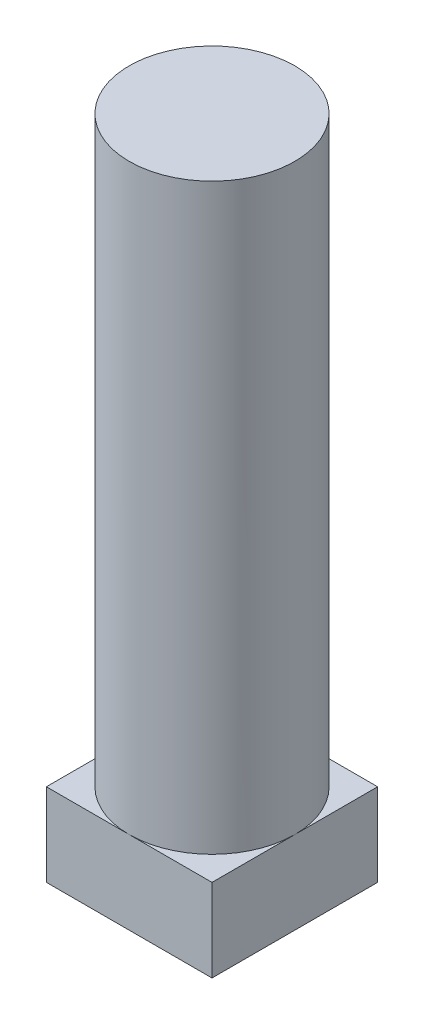
ISO-10303-21;
HEADER;
FILE_DESCRIPTION(('STEP AP214'),'2;1');
FILE_NAME('part.step','',(''),(''),'','','');
FILE_SCHEMA(('AUTOMOTIVE_DESIGN { 1 0 10303 214 1 1 1 1 }'));
ENDSEC;
DATA;
#1=APPLICATION_CONTEXT('core data for automotive mechanical design processes');
#2=APPLICATION_PROTOCOL_DEFINITION('international standard','automotive_design',2000,#1);
#3=PRODUCT_CONTEXT('',#1,'mechanical');
#4=PRODUCT('Part','Part','',(#3));
#5=PRODUCT_RELATED_PRODUCT_CATEGORY('part','',(#4));
#6=PRODUCT_DEFINITION_FORMATION('','',#4);
#7=PRODUCT_DEFINITION_CONTEXT('part definition',#1,'design');
#8=PRODUCT_DEFINITION('design','',#6,#7);
#9=PRODUCT_DEFINITION_SHAPE('','',#8);
#10=(LENGTH_UNIT() NAMED_UNIT(*) SI_UNIT(.MILLI.,.METRE.));
#11=(NAMED_UNIT(*) PLANE_ANGLE_UNIT() SI_UNIT($,.RADIAN.));
#12=(NAMED_UNIT(*) SI_UNIT($,.STERADIAN.) SOLID_ANGLE_UNIT());
#13=UNCERTAINTY_MEASURE_WITH_UNIT(LENGTH_MEASURE(1.E-05),#10,'distance_accuracy_value','');
#14=(GEOMETRIC_REPRESENTATION_CONTEXT(3) GLOBAL_UNCERTAINTY_ASSIGNED_CONTEXT((#13)) GLOBAL_UNIT_ASSIGNED_CONTEXT((#10,
#11,#12)) REPRESENTATION_CONTEXT('',''));
#15=CARTESIAN_POINT('',(0.,0.,0.));
#16=DIRECTION('',(0.,0.,1.));
#17=DIRECTION('',(1.,0.,0.));
#18=AXIS2_PLACEMENT_3D('',#15,#16,#17);
#19=CARTESIAN_POINT('',(0.,2.5,0.));
#20=DIRECTION('',(0.,1.,0.));
#21=DIRECTION('',(0.,0.,1.));
#22=AXIS2_PLACEMENT_3D('',#19,#20,#21);
#23=PLANE('',#22);
#24=CARTESIAN_POINT('',(0.,2.5,0.));
#25=DIRECTION('',(0.,1.,0.));
#26=DIRECTION('',(0.,0.,1.));
#27=AXIS2_PLACEMENT_3D('',#24,#25,#26);
#28=CIRCLE('',#27,2.5);
#29=CARTESIAN_POINT('',(0.,2.5,2.5));
#30=VERTEX_POINT('',#29);
#31=CARTESIAN_POINT('',(2.5,2.5,0.));
#32=VERTEX_POINT('',#31);
#33=EDGE_CURVE('E49',#30,#32,#28,.T.);
#34=ORIENTED_EDGE('',*,*,#33,.F.);
#35=DIRECTION('',(1.,0.,0.));
#36=VECTOR('',#35,1.);
#37=CARTESIAN_POINT('',(-2.5,2.5,2.5));
#38=LINE('',#37,#36);
#39=CARTESIAN_POINT('',(2.5,2.5,2.5));
#40=VERTEX_POINT('',#39);
#41=EDGE_CURVE('E100',#30,#40,#38,.T.);
#42=ORIENTED_EDGE('',*,*,#41,.T.);
#43=DIRECTION('',(0.,0.,-1.));
#44=VECTOR('',#43,1.);
#45=CARTESIAN_POINT('',(2.5,2.5,2.5));
#46=LINE('',#45,#44);
#47=EDGE_CURVE('E111',#40,#32,#46,.T.);
#48=ORIENTED_EDGE('',*,*,#47,.T.);
#49=EDGE_LOOP('',(#34,#42,#48));
#50=FACE_BOUND('',#49,.T.);
#51=ADVANCED_FACE('F38',(#50),#23,.T.);
#52=CARTESIAN_POINT('',(0.,2.5,-2.5));
#53=VERTEX_POINT('',#52);
#54=EDGE_CURVE('E11',#32,#53,#28,.T.);
#55=ORIENTED_EDGE('',*,*,#54,.F.);
#56=CARTESIAN_POINT('',(2.5,2.5,-2.5));
#57=VERTEX_POINT('',#56);
#58=EDGE_CURVE('E99',#32,#57,#46,.T.);
#59=ORIENTED_EDGE('',*,*,#58,.T.);
#60=DIRECTION('',(1.,0.,0.));
#61=VECTOR('',#60,1.);
#62=CARTESIAN_POINT('',(-2.5,2.5,-2.5));
#63=LINE('',#62,#61);
#64=EDGE_CURVE('E119',#53,#57,#63,.T.);
#65=ORIENTED_EDGE('',*,*,#64,.F.);
#66=EDGE_LOOP('',(#55,#59,#65));
#67=FACE_BOUND('',#66,.T.);
#68=ADVANCED_FACE('F155',(#67),#23,.T.);
#69=CARTESIAN_POINT('',(-2.5,2.5,0.));
#70=VERTEX_POINT('',#69);
#71=EDGE_CURVE('E47',#53,#70,#28,.T.);
#72=ORIENTED_EDGE('',*,*,#71,.F.);
#73=CARTESIAN_POINT('',(-2.5,2.5,-2.5));
#74=VERTEX_POINT('',#73);
#75=EDGE_CURVE('E120',#74,#53,#63,.T.);
#76=ORIENTED_EDGE('',*,*,#75,.F.);
#77=DIRECTION('',(0.,0.,-1.));
#78=VECTOR('',#77,1.);
#79=CARTESIAN_POINT('',(-2.5,2.5,2.5));
#80=LINE('',#79,#78);
#81=EDGE_CURVE('E123',#70,#74,#80,.T.);
#82=ORIENTED_EDGE('',*,*,#81,.F.);
#83=EDGE_LOOP('',(#72,#76,#82));
#84=FACE_BOUND('',#83,.T.);
#85=ADVANCED_FACE('F153',(#84),#23,.T.);
#86=CARTESIAN_POINT('',(-2.5,2.5,2.5));
#87=DIRECTION('',(0.,0.,-1.));
#88=DIRECTION('',(-1.,0.,0.));
#89=AXIS2_PLACEMENT_3D('',#86,#87,#88);
#90=PLANE('',#89);
#91=DIRECTION('',(1.,0.,0.));
#92=VECTOR('',#91,1.);
#93=CARTESIAN_POINT('',(-2.5,0.,2.5));
#94=LINE('',#93,#92);
#95=CARTESIAN_POINT('',(-2.5,0.,2.5));
#96=VERTEX_POINT('',#95);
#97=CARTESIAN_POINT('',(2.5,0.,2.5));
#98=VERTEX_POINT('',#97);
#99=EDGE_CURVE('E126',#96,#98,#94,.T.);
#100=ORIENTED_EDGE('',*,*,#99,.T.);
#101=DIRECTION('',(0.,-1.,0.));
#102=VECTOR('',#101,1.);
#103=CARTESIAN_POINT('',(2.5,2.5,2.5));
#104=LINE('',#103,#102);
#105=EDGE_CURVE('E42',#40,#98,#104,.T.);
#106=ORIENTED_EDGE('',*,*,#105,.F.);
#107=ORIENTED_EDGE('',*,*,#41,.F.);
#108=CARTESIAN_POINT('',(-2.5,2.5,2.5));
#109=VERTEX_POINT('',#108);
#110=EDGE_CURVE('E93',#109,#30,#38,.T.);
#111=ORIENTED_EDGE('',*,*,#110,.F.);
#112=DIRECTION('',(0.,-1.,0.));
#113=VECTOR('',#112,1.);
#114=CARTESIAN_POINT('',(-2.5,2.5,2.5));
#115=LINE('',#114,#113);
#116=EDGE_CURVE('E125',#109,#96,#115,.T.);
#117=ORIENTED_EDGE('',*,*,#116,.T.);
#118=EDGE_LOOP('',(#100,#106,#107,#111,#117));
#119=FACE_BOUND('',#118,.T.);
#120=ADVANCED_FACE('F40',(#119),#90,.F.);
#121=CARTESIAN_POINT('',(2.5,2.5,2.5));
#122=DIRECTION('',(-1.,0.,0.));
#123=DIRECTION('',(0.,0.,1.));
#124=AXIS2_PLACEMENT_3D('',#121,#122,#123);
#125=PLANE('',#124);
#126=DIRECTION('',(0.,0.,-1.));
#127=VECTOR('',#126,1.);
#128=CARTESIAN_POINT('',(2.5,0.,2.5));
#129=LINE('',#128,#127);
#130=CARTESIAN_POINT('',(2.5,0.,-2.5));
#131=VERTEX_POINT('',#130);
#132=EDGE_CURVE('E128',#98,#131,#129,.T.);
#133=ORIENTED_EDGE('',*,*,#132,.T.);
#134=DIRECTION('',(0.,-1.,0.));
#135=VECTOR('',#134,1.);
#136=CARTESIAN_POINT('',(2.5,2.5,-2.5));
#137=LINE('',#136,#135);
#138=EDGE_CURVE('E115',#57,#131,#137,.T.);
#139=ORIENTED_EDGE('',*,*,#138,.F.);
#140=ORIENTED_EDGE('',*,*,#58,.F.);
#141=ORIENTED_EDGE('',*,*,#47,.F.);
#142=ORIENTED_EDGE('',*,*,#105,.T.);
#143=EDGE_LOOP('',(#133,#139,#140,#141,#142));
#144=FACE_BOUND('',#143,.T.);
#145=ADVANCED_FACE('F146',(#144),#125,.F.);
#146=CARTESIAN_POINT('',(-2.5,2.5,-2.5));
#147=DIRECTION('',(0.,0.,-1.));
#148=DIRECTION('',(-1.,0.,0.));
#149=AXIS2_PLACEMENT_3D('',#146,#147,#148);
#150=PLANE('',#149);
#151=DIRECTION('',(1.,0.,0.));
#152=VECTOR('',#151,1.);
#153=CARTESIAN_POINT('',(-2.5,0.,-2.5));
#154=LINE('',#153,#152);
#155=CARTESIAN_POINT('',(-2.5,0.,-2.5));
#156=VERTEX_POINT('',#155);
#157=EDGE_CURVE('E131',#156,#131,#154,.T.);
#158=ORIENTED_EDGE('',*,*,#157,.F.);
#159=DIRECTION('',(0.,-1.,0.));
#160=VECTOR('',#159,1.);
#161=CARTESIAN_POINT('',(-2.5,2.5,-2.5));
#162=LINE('',#161,#160);
#163=EDGE_CURVE('E137',#74,#156,#162,.T.);
#164=ORIENTED_EDGE('',*,*,#163,.F.);
#165=ORIENTED_EDGE('',*,*,#75,.T.);
#166=ORIENTED_EDGE('',*,*,#64,.T.);
#167=ORIENTED_EDGE('',*,*,#138,.T.);
#168=EDGE_LOOP('',(#158,#164,#165,#166,#167));
#169=FACE_BOUND('',#168,.T.);
#170=ADVANCED_FACE('F141',(#169),#150,.T.);
#171=CARTESIAN_POINT('',(-2.5,2.5,2.5));
#172=DIRECTION('',(-1.,0.,0.));
#173=DIRECTION('',(0.,0.,1.));
#174=AXIS2_PLACEMENT_3D('',#171,#172,#173);
#175=PLANE('',#174);
#176=DIRECTION('',(0.,0.,-1.));
#177=VECTOR('',#176,1.);
#178=CARTESIAN_POINT('',(-2.5,0.,2.5));
#179=LINE('',#178,#177);
#180=EDGE_CURVE('E109',#96,#156,#179,.T.);
#181=ORIENTED_EDGE('',*,*,#180,.F.);
#182=ORIENTED_EDGE('',*,*,#116,.F.);
#183=EDGE_CURVE('E97',#109,#70,#80,.T.);
#184=ORIENTED_EDGE('',*,*,#183,.T.);
#185=ORIENTED_EDGE('',*,*,#81,.T.);
#186=ORIENTED_EDGE('',*,*,#163,.T.);
#187=EDGE_LOOP('',(#181,#182,#184,#185,#186));
#188=FACE_BOUND('',#187,.T.);
#189=ADVANCED_FACE('F152',(#188),#175,.T.);
#190=EDGE_CURVE('E56',#70,#30,#28,.T.);
#191=ORIENTED_EDGE('',*,*,#190,.F.);
#192=ORIENTED_EDGE('',*,*,#183,.F.);
#193=ORIENTED_EDGE('',*,*,#110,.T.);
#194=EDGE_LOOP('',(#191,#192,#193));
#195=FACE_BOUND('',#194,.T.);
#196=ADVANCED_FACE('F95',(#195),#23,.T.);
#197=CARTESIAN_POINT('',(0.,0.,0.));
#198=DIRECTION('',(0.,1.,0.));
#199=DIRECTION('',(0.,0.,1.));
#200=AXIS2_PLACEMENT_3D('',#197,#198,#199);
#201=PLANE('',#200);
#202=ORIENTED_EDGE('',*,*,#99,.F.);
#203=ORIENTED_EDGE('',*,*,#180,.T.);
#204=ORIENTED_EDGE('',*,*,#157,.T.);
#205=ORIENTED_EDGE('',*,*,#132,.F.);
#206=EDGE_LOOP('',(#202,#203,#204,#205));
#207=FACE_BOUND('',#206,.T.);
#208=ADVANCED_FACE('F149',(#207),#201,.F.);
#209=CARTESIAN_POINT('',(0.,20.1,0.));
#210=DIRECTION('',(0.,-1.,0.));
#211=DIRECTION('',(0.,0.,-1.));
#212=AXIS2_PLACEMENT_3D('',#209,#210,#211);
#213=CYLINDRICAL_SURFACE('',#212,2.5);
#214=CARTESIAN_POINT('',(0.,20.1,0.));
#215=DIRECTION('',(0.,1.,0.));
#216=DIRECTION('',(0.,0.,1.));
#217=AXIS2_PLACEMENT_3D('',#214,#215,#216);
#218=CIRCLE('',#217,2.5);
#219=CARTESIAN_POINT('',(0.,20.1,2.5));
#220=VERTEX_POINT('',#219);
#221=EDGE_CURVE('E113',#220,#220,#218,.T.);
#222=ORIENTED_EDGE('',*,*,#221,.F.);
#223=EDGE_LOOP('',(#222));
#224=FACE_BOUND('',#223,.T.);
#225=ORIENTED_EDGE('',*,*,#33,.T.);
#226=ORIENTED_EDGE('',*,*,#54,.T.);
#227=ORIENTED_EDGE('',*,*,#71,.T.);
#228=ORIENTED_EDGE('',*,*,#190,.T.);
#229=EDGE_LOOP('',(#225,#226,#227,#228));
#230=FACE_BOUND('',#229,.T.);
#231=ADVANCED_FACE('F114',(#224,#230),#213,.T.);
#232=CARTESIAN_POINT('',(0.,20.1,0.));
#233=DIRECTION('',(0.,1.,0.));
#234=DIRECTION('',(0.,0.,1.));
#235=AXIS2_PLACEMENT_3D('',#232,#233,#234);
#236=PLANE('',#235);
#237=ORIENTED_EDGE('',*,*,#221,.T.);
#238=EDGE_LOOP('',(#237));
#239=FACE_BOUND('',#238,.T.);
#240=ADVANCED_FACE('F231',(#239),#236,.T.);
#241=CLOSED_SHELL('',(#51,#68,#85,#120,#145,#170,#189,#196,#208,#231,#240));
#242=MANIFOLD_SOLID_BREP('B2',#241);
#243=ADVANCED_BREP_SHAPE_REPRESENTATION('',(#18,#242),#14);
#244=SHAPE_DEFINITION_REPRESENTATION(#9,#243);
ENDSEC;
END-ISO-10303-21;
